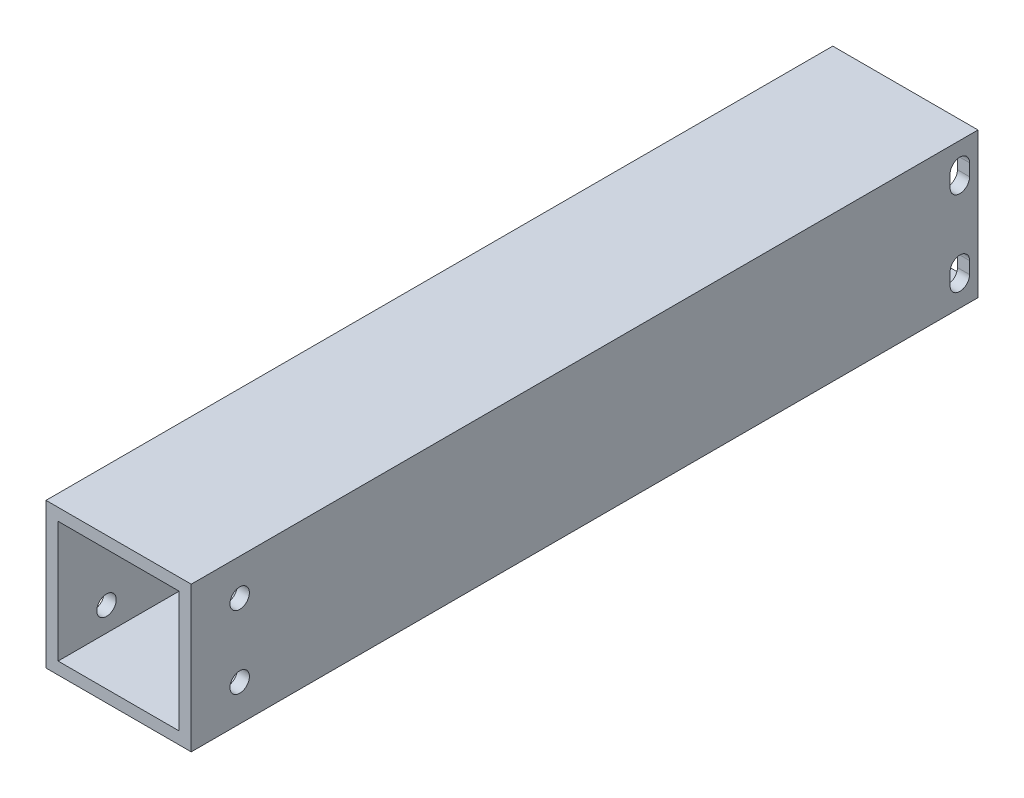
ISO-10303-21;
HEADER;
FILE_DESCRIPTION(('STEP AP214'),'2;1');
FILE_NAME('part.step','',(''),(''),'','','');
FILE_SCHEMA(('AUTOMOTIVE_DESIGN { 1 0 10303 214 1 1 1 1 }'));
ENDSEC;
DATA;
#1=APPLICATION_CONTEXT('core data for automotive mechanical design processes');
#2=APPLICATION_PROTOCOL_DEFINITION('international standard','automotive_design',2000,#1);
#3=PRODUCT_CONTEXT('',#1,'mechanical');
#4=PRODUCT('Part','Part','',(#3));
#5=PRODUCT_RELATED_PRODUCT_CATEGORY('part','',(#4));
#6=PRODUCT_DEFINITION_FORMATION('','',#4);
#7=PRODUCT_DEFINITION_CONTEXT('part definition',#1,'design');
#8=PRODUCT_DEFINITION('design','',#6,#7);
#9=PRODUCT_DEFINITION_SHAPE('','',#8);
#10=(LENGTH_UNIT() NAMED_UNIT(*) SI_UNIT(.MILLI.,.METRE.));
#11=(NAMED_UNIT(*) PLANE_ANGLE_UNIT() SI_UNIT($,.RADIAN.));
#12=(NAMED_UNIT(*) SI_UNIT($,.STERADIAN.) SOLID_ANGLE_UNIT());
#13=UNCERTAINTY_MEASURE_WITH_UNIT(LENGTH_MEASURE(1.E-05),#10,'distance_accuracy_value','');
#14=(GEOMETRIC_REPRESENTATION_CONTEXT(3) GLOBAL_UNCERTAINTY_ASSIGNED_CONTEXT((#13)) GLOBAL_UNIT_ASSIGNED_CONTEXT((#10,
#11,#12)) REPRESENTATION_CONTEXT('',''));
#15=CARTESIAN_POINT('',(0.,0.,0.));
#16=DIRECTION('',(0.,0.,1.));
#17=DIRECTION('',(1.,0.,0.));
#18=AXIS2_PLACEMENT_3D('',#15,#16,#17);
#19=CARTESIAN_POINT('',(0.,28.575,157.1625));
#20=DIRECTION('',(1.,0.,0.));
#21=DIRECTION('',(0.,0.,-1.));
#22=AXIS2_PLACEMENT_3D('',#19,#20,#21);
#23=CYLINDRICAL_SURFACE('',#22,2.55269999999999);
#24=CARTESIAN_POINT('',(0.,28.575,157.1625));
#25=DIRECTION('',(1.,0.,0.));
#26=DIRECTION('',(0.,0.,-1.));
#27=AXIS2_PLACEMENT_3D('',#24,#25,#26);
#28=CIRCLE('',#27,2.55269999999999);
#29=CARTESIAN_POINT('',(0.,28.575,159.7152));
#30=VERTEX_POINT('',#29);
#31=CARTESIAN_POINT('',(0.,28.575,154.6098));
#32=VERTEX_POINT('',#31);
#33=EDGE_CURVE('E273',#30,#32,#28,.T.);
#34=ORIENTED_EDGE('',*,*,#33,.F.);
#35=DIRECTION('',(1.,0.,0.));
#36=VECTOR('',#35,1.);
#37=CARTESIAN_POINT('',(0.,28.575,159.7152));
#38=LINE('',#37,#36);
#39=CARTESIAN_POINT('',(3.1749999999017,28.575,159.7152));
#40=VERTEX_POINT('',#39);
#41=EDGE_CURVE('E187',#30,#40,#38,.T.);
#42=ORIENTED_EDGE('',*,*,#41,.T.);
#43=CARTESIAN_POINT('',(3.1749999999017,28.575,157.1625));
#44=DIRECTION('',(1.,0.,0.));
#45=DIRECTION('',(0.,0.,-1.));
#46=AXIS2_PLACEMENT_3D('',#43,#44,#45);
#47=CIRCLE('',#46,2.55269999999999);
#48=CARTESIAN_POINT('',(3.1749999999017,28.575,154.6098));
#49=VERTEX_POINT('',#48);
#50=EDGE_CURVE('E195',#40,#49,#47,.T.);
#51=ORIENTED_EDGE('',*,*,#50,.T.);
#52=DIRECTION('',(-1.,0.,0.));
#53=VECTOR('',#52,1.);
#54=CARTESIAN_POINT('',(0.,28.575,154.6098));
#55=LINE('',#54,#53);
#56=EDGE_CURVE('E216',#49,#32,#55,.T.);
#57=ORIENTED_EDGE('',*,*,#56,.T.);
#58=EDGE_LOOP('',(#34,#42,#51,#57));
#59=FACE_BOUND('',#58,.T.);
#60=ADVANCED_FACE('F16',(#59),#23,.F.);
#61=CARTESIAN_POINT('',(0.,28.575,154.6098));
#62=DIRECTION('',(0.,0.,-1.));
#63=DIRECTION('',(-1.,0.,0.));
#64=AXIS2_PLACEMENT_3D('',#61,#62,#63);
#65=PLANE('',#64);
#66=DIRECTION('',(0.,1.,0.));
#67=VECTOR('',#66,1.);
#68=CARTESIAN_POINT('',(0.,38.1,154.6098));
#69=LINE('',#68,#67);
#70=CARTESIAN_POINT('',(0.,31.75,154.6098));
#71=VERTEX_POINT('',#70);
#72=EDGE_CURVE('E272',#32,#71,#69,.T.);
#73=ORIENTED_EDGE('',*,*,#72,.F.);
#74=ORIENTED_EDGE('',*,*,#56,.F.);
#75=DIRECTION('',(0.,-1.,0.));
#76=VECTOR('',#75,1.);
#77=CARTESIAN_POINT('',(3.1749999999017,34.925,154.6098));
#78=LINE('',#77,#76);
#79=CARTESIAN_POINT('',(3.1749999999017,31.75,154.6098));
#80=VERTEX_POINT('',#79);
#81=EDGE_CURVE('E306',#49,#80,#78,.F.);
#82=ORIENTED_EDGE('',*,*,#81,.T.);
#83=DIRECTION('',(1.,0.,0.));
#84=VECTOR('',#83,1.);
#85=CARTESIAN_POINT('',(0.,31.75,154.6098));
#86=LINE('',#85,#84);
#87=EDGE_CURVE('E174',#80,#71,#86,.F.);
#88=ORIENTED_EDGE('',*,*,#87,.T.);
#89=EDGE_LOOP('',(#73,#74,#82,#88));
#90=FACE_BOUND('',#89,.T.);
#91=ADVANCED_FACE('F692',(#90),#65,.F.);
#92=CARTESIAN_POINT('',(0.,31.75,157.1625));
#93=DIRECTION('',(1.,0.,0.));
#94=DIRECTION('',(0.,0.,-1.));
#95=AXIS2_PLACEMENT_3D('',#92,#93,#94);
#96=CYLINDRICAL_SURFACE('',#95,2.55269999999999);
#97=CARTESIAN_POINT('',(0.,31.75,157.1625));
#98=DIRECTION('',(1.,0.,0.));
#99=DIRECTION('',(0.,0.,-1.));
#100=AXIS2_PLACEMENT_3D('',#97,#98,#99);
#101=CIRCLE('',#100,2.55269999999999);
#102=CARTESIAN_POINT('',(0.,31.75,159.7152));
#103=VERTEX_POINT('',#102);
#104=EDGE_CURVE('E270',#71,#103,#101,.T.);
#105=ORIENTED_EDGE('',*,*,#104,.F.);
#106=ORIENTED_EDGE('',*,*,#87,.F.);
#107=CARTESIAN_POINT('',(3.1749999999017,31.75,157.1625));
#108=DIRECTION('',(1.,0.,0.));
#109=DIRECTION('',(0.,0.,-1.));
#110=AXIS2_PLACEMENT_3D('',#107,#108,#109);
#111=CIRCLE('',#110,2.55269999999999);
#112=CARTESIAN_POINT('',(3.1749999999017,31.75,159.7152));
#113=VERTEX_POINT('',#112);
#114=EDGE_CURVE('E19',#80,#113,#111,.T.);
#115=ORIENTED_EDGE('',*,*,#114,.T.);
#116=DIRECTION('',(1.,0.,0.));
#117=VECTOR('',#116,1.);
#118=CARTESIAN_POINT('',(0.,31.75,159.7152));
#119=LINE('',#118,#117);
#120=EDGE_CURVE('E181',#113,#103,#119,.F.);
#121=ORIENTED_EDGE('',*,*,#120,.T.);
#122=EDGE_LOOP('',(#105,#106,#115,#121));
#123=FACE_BOUND('',#122,.T.);
#124=ADVANCED_FACE('F197',(#123),#96,.F.);
#125=CARTESIAN_POINT('',(0.,28.575,159.7152));
#126=DIRECTION('',(0.,0.,1.));
#127=DIRECTION('',(1.,0.,0.));
#128=AXIS2_PLACEMENT_3D('',#125,#126,#127);
#129=PLANE('',#128);
#130=DIRECTION('',(0.,1.,0.));
#131=VECTOR('',#130,1.);
#132=CARTESIAN_POINT('',(0.,38.1,159.7152));
#133=LINE('',#132,#131);
#134=EDGE_CURVE('E186',#103,#30,#133,.F.);
#135=ORIENTED_EDGE('',*,*,#134,.F.);
#136=ORIENTED_EDGE('',*,*,#120,.F.);
#137=DIRECTION('',(0.,-1.,0.));
#138=VECTOR('',#137,1.);
#139=CARTESIAN_POINT('',(3.1749999999017,34.925,159.7152));
#140=LINE('',#139,#138);
#141=EDGE_CURVE('E184',#113,#40,#140,.T.);
#142=ORIENTED_EDGE('',*,*,#141,.T.);
#143=ORIENTED_EDGE('',*,*,#41,.F.);
#144=EDGE_LOOP('',(#135,#136,#142,#143));
#145=FACE_BOUND('',#144,.T.);
#146=ADVANCED_FACE('F183',(#145),#129,.F.);
#147=CARTESIAN_POINT('',(0.,9.525,346.075));
#148=DIRECTION('',(1.,0.,0.));
#149=DIRECTION('',(0.,0.,-1.));
#150=AXIS2_PLACEMENT_3D('',#147,#148,#149);
#151=CYLINDRICAL_SURFACE('',#150,2.55270000000002);
#152=CARTESIAN_POINT('',(3.1749999999017,9.525,346.075));
#153=DIRECTION('',(1.,0.,0.));
#154=DIRECTION('',(0.,0.,-1.));
#155=AXIS2_PLACEMENT_3D('',#152,#153,#154);
#156=CIRCLE('',#155,2.55270000000002);
#157=CARTESIAN_POINT('',(3.1749999999017,9.525,343.5223));
#158=VERTEX_POINT('',#157);
#159=EDGE_CURVE('E304',#158,#158,#156,.T.);
#160=ORIENTED_EDGE('',*,*,#159,.T.);
#161=EDGE_LOOP('',(#160));
#162=FACE_BOUND('',#161,.T.);
#163=CARTESIAN_POINT('',(0.,9.525,346.075));
#164=DIRECTION('',(1.,0.,0.));
#165=DIRECTION('',(0.,0.,-1.));
#166=AXIS2_PLACEMENT_3D('',#163,#164,#165);
#167=CIRCLE('',#166,2.55270000000002);
#168=CARTESIAN_POINT('',(0.,9.525,343.5223));
#169=VERTEX_POINT('',#168);
#170=EDGE_CURVE('E267',#169,#169,#167,.T.);
#171=ORIENTED_EDGE('',*,*,#170,.F.);
#172=EDGE_LOOP('',(#171));
#173=FACE_BOUND('',#172,.T.);
#174=ADVANCED_FACE('F668',(#162,#173),#151,.F.);
#175=CARTESIAN_POINT('',(0.,28.575,346.075));
#176=DIRECTION('',(1.,0.,0.));
#177=DIRECTION('',(0.,0.,-1.));
#178=AXIS2_PLACEMENT_3D('',#175,#176,#177);
#179=CYLINDRICAL_SURFACE('',#178,2.55270000000002);
#180=CARTESIAN_POINT('',(3.1749999999017,28.575,346.075));
#181=DIRECTION('',(1.,0.,0.));
#182=DIRECTION('',(0.,0.,-1.));
#183=AXIS2_PLACEMENT_3D('',#180,#181,#182);
#184=CIRCLE('',#183,2.55270000000002);
#185=CARTESIAN_POINT('',(3.1749999999017,28.575,343.5223));
#186=VERTEX_POINT('',#185);
#187=EDGE_CURVE('E301',#186,#186,#184,.T.);
#188=ORIENTED_EDGE('',*,*,#187,.T.);
#189=EDGE_LOOP('',(#188));
#190=FACE_BOUND('',#189,.T.);
#191=CARTESIAN_POINT('',(0.,28.575,346.075));
#192=DIRECTION('',(1.,0.,0.));
#193=DIRECTION('',(0.,0.,-1.));
#194=AXIS2_PLACEMENT_3D('',#191,#192,#193);
#195=CIRCLE('',#194,2.55270000000002);
#196=CARTESIAN_POINT('',(0.,28.575,343.5223));
#197=VERTEX_POINT('',#196);
#198=EDGE_CURVE('E264',#197,#197,#195,.T.);
#199=ORIENTED_EDGE('',*,*,#198,.F.);
#200=EDGE_LOOP('',(#199));
#201=FACE_BOUND('',#200,.T.);
#202=ADVANCED_FACE('F660',(#190,#201),#179,.F.);
#203=CARTESIAN_POINT('',(0.,9.525,157.1625));
#204=DIRECTION('',(1.,0.,0.));
#205=DIRECTION('',(0.,0.,-1.));
#206=AXIS2_PLACEMENT_3D('',#203,#204,#205);
#207=CYLINDRICAL_SURFACE('',#206,2.55269999999999);
#208=CARTESIAN_POINT('',(0.,9.525,157.1625));
#209=DIRECTION('',(1.,0.,0.));
#210=DIRECTION('',(0.,0.,-1.));
#211=AXIS2_PLACEMENT_3D('',#208,#209,#210);
#212=CIRCLE('',#211,2.55269999999999);
#213=CARTESIAN_POINT('',(0.,9.525,154.6098));
#214=VERTEX_POINT('',#213);
#215=CARTESIAN_POINT('',(0.,9.525,159.7152));
#216=VERTEX_POINT('',#215);
#217=EDGE_CURVE('E262',#214,#216,#212,.T.);
#218=ORIENTED_EDGE('',*,*,#217,.F.);
#219=DIRECTION('',(-1.,0.,0.));
#220=VECTOR('',#219,1.);
#221=CARTESIAN_POINT('',(0.,9.525,154.6098));
#222=LINE('',#221,#220);
#223=CARTESIAN_POINT('',(3.1749999999017,9.525,154.6098));
#224=VERTEX_POINT('',#223);
#225=EDGE_CURVE('E198',#214,#224,#222,.F.);
#226=ORIENTED_EDGE('',*,*,#225,.T.);
#227=CARTESIAN_POINT('',(3.1749999999017,9.525,157.1625));
#228=DIRECTION('',(1.,0.,0.));
#229=DIRECTION('',(0.,0.,-1.));
#230=AXIS2_PLACEMENT_3D('',#227,#228,#229);
#231=CIRCLE('',#230,2.55269999999999);
#232=CARTESIAN_POINT('',(3.1749999999017,9.525,159.7152));
#233=VERTEX_POINT('',#232);
#234=EDGE_CURVE('E294',#224,#233,#231,.T.);
#235=ORIENTED_EDGE('',*,*,#234,.T.);
#236=DIRECTION('',(1.,0.,0.));
#237=VECTOR('',#236,1.);
#238=CARTESIAN_POINT('',(0.,9.525,159.7152));
#239=LINE('',#238,#237);
#240=EDGE_CURVE('E211',#233,#216,#239,.F.);
#241=ORIENTED_EDGE('',*,*,#240,.T.);
#242=EDGE_LOOP('',(#218,#226,#235,#241));
#243=FACE_BOUND('',#242,.T.);
#244=ADVANCED_FACE('F651',(#243),#207,.F.);
#245=CARTESIAN_POINT('',(0.,9.525,159.7152));
#246=DIRECTION('',(0.,0.,1.));
#247=DIRECTION('',(1.,0.,0.));
#248=AXIS2_PLACEMENT_3D('',#245,#246,#247);
#249=PLANE('',#248);
#250=DIRECTION('',(0.,1.,0.));
#251=VECTOR('',#250,1.);
#252=CARTESIAN_POINT('',(0.,38.1,159.7152));
#253=LINE('',#252,#251);
#254=CARTESIAN_POINT('',(0.,6.34999999999999,159.7152));
#255=VERTEX_POINT('',#254);
#256=EDGE_CURVE('E261',#216,#255,#253,.F.);
#257=ORIENTED_EDGE('',*,*,#256,.F.);
#258=ORIENTED_EDGE('',*,*,#240,.F.);
#259=DIRECTION('',(0.,-1.,0.));
#260=VECTOR('',#259,1.);
#261=CARTESIAN_POINT('',(3.1749999999017,34.925,159.7152));
#262=LINE('',#261,#260);
#263=CARTESIAN_POINT('',(3.1749999999017,6.34999999999999,159.7152));
#264=VERTEX_POINT('',#263);
#265=EDGE_CURVE('E296',#233,#264,#262,.T.);
#266=ORIENTED_EDGE('',*,*,#265,.T.);
#267=DIRECTION('',(1.,0.,0.));
#268=VECTOR('',#267,1.);
#269=CARTESIAN_POINT('',(0.,6.34999999999999,159.7152));
#270=LINE('',#269,#268);
#271=EDGE_CURVE('E206',#264,#255,#270,.F.);
#272=ORIENTED_EDGE('',*,*,#271,.T.);
#273=EDGE_LOOP('',(#257,#258,#266,#272));
#274=FACE_BOUND('',#273,.T.);
#275=ADVANCED_FACE('F642',(#274),#249,.F.);
#276=CARTESIAN_POINT('',(0.,6.34999999999999,157.1625));
#277=DIRECTION('',(1.,0.,0.));
#278=DIRECTION('',(0.,0.,-1.));
#279=AXIS2_PLACEMENT_3D('',#276,#277,#278);
#280=CYLINDRICAL_SURFACE('',#279,2.55269999999999);
#281=CARTESIAN_POINT('',(0.,6.34999999999999,157.1625));
#282=DIRECTION('',(1.,0.,0.));
#283=DIRECTION('',(0.,0.,-1.));
#284=AXIS2_PLACEMENT_3D('',#281,#282,#283);
#285=CIRCLE('',#284,2.55269999999999);
#286=CARTESIAN_POINT('',(0.,6.34999999999999,154.6098));
#287=VERTEX_POINT('',#286);
#288=EDGE_CURVE('E258',#255,#287,#285,.T.);
#289=ORIENTED_EDGE('',*,*,#288,.F.);
#290=ORIENTED_EDGE('',*,*,#271,.F.);
#291=CARTESIAN_POINT('',(3.1749999999017,6.34999999999999,157.1625));
#292=DIRECTION('',(1.,0.,0.));
#293=DIRECTION('',(0.,0.,-1.));
#294=AXIS2_PLACEMENT_3D('',#291,#292,#293);
#295=CIRCLE('',#294,2.55269999999999);
#296=CARTESIAN_POINT('',(3.1749999999017,6.34999999999999,154.6098));
#297=VERTEX_POINT('',#296);
#298=EDGE_CURVE('E298',#264,#297,#295,.T.);
#299=ORIENTED_EDGE('',*,*,#298,.T.);
#300=DIRECTION('',(-1.,0.,0.));
#301=VECTOR('',#300,1.);
#302=CARTESIAN_POINT('',(0.,6.34999999999999,154.6098));
#303=LINE('',#302,#301);
#304=EDGE_CURVE('E199',#297,#287,#303,.T.);
#305=ORIENTED_EDGE('',*,*,#304,.T.);
#306=EDGE_LOOP('',(#289,#290,#299,#305));
#307=FACE_BOUND('',#306,.T.);
#308=ADVANCED_FACE('F633',(#307),#280,.F.);
#309=CARTESIAN_POINT('',(0.,9.525,154.6098));
#310=DIRECTION('',(0.,0.,-1.));
#311=DIRECTION('',(-1.,0.,0.));
#312=AXIS2_PLACEMENT_3D('',#309,#310,#311);
#313=PLANE('',#312);
#314=DIRECTION('',(0.,1.,0.));
#315=VECTOR('',#314,1.);
#316=CARTESIAN_POINT('',(0.,38.1,154.6098));
#317=LINE('',#316,#315);
#318=EDGE_CURVE('E260',#287,#214,#317,.T.);
#319=ORIENTED_EDGE('',*,*,#318,.F.);
#320=ORIENTED_EDGE('',*,*,#304,.F.);
#321=DIRECTION('',(0.,-1.,0.));
#322=VECTOR('',#321,1.);
#323=CARTESIAN_POINT('',(3.1749999999017,34.925,154.6098));
#324=LINE('',#323,#322);
#325=EDGE_CURVE('E297',#297,#224,#324,.F.);
#326=ORIENTED_EDGE('',*,*,#325,.T.);
#327=ORIENTED_EDGE('',*,*,#225,.F.);
#328=EDGE_LOOP('',(#319,#320,#326,#327));
#329=FACE_BOUND('',#328,.T.);
#330=ADVANCED_FACE('F624',(#329),#313,.F.);
#331=CARTESIAN_POINT('',(3.1749999999017,34.925,152.4));
#332=DIRECTION('',(-1.,0.,0.));
#333=DIRECTION('',(0.,-1.,0.));
#334=AXIS2_PLACEMENT_3D('',#331,#332,#333);
#335=PLANE('',#334);
#336=DIRECTION('',(0.,0.,-1.));
#337=VECTOR('',#336,1.);
#338=CARTESIAN_POINT('',(3.1749999999017,3.17499999992628,152.4));
#339=LINE('',#338,#337);
#340=CARTESIAN_POINT('',(3.1749999999017,3.17499999992628,358.775));
#341=VERTEX_POINT('',#340);
#342=CARTESIAN_POINT('',(3.1749999999017,3.17499999992628,152.4));
#343=VERTEX_POINT('',#342);
#344=EDGE_CURVE('E315',#341,#343,#339,.T.);
#345=ORIENTED_EDGE('',*,*,#344,.T.);
#346=DIRECTION('',(0.,1.,0.));
#347=VECTOR('',#346,1.);
#348=CARTESIAN_POINT('',(3.1749999999017,38.1,152.4));
#349=LINE('',#348,#347);
#350=CARTESIAN_POINT('',(3.1749999999017,34.925,152.4));
#351=VERTEX_POINT('',#350);
#352=EDGE_CURVE('E364',#351,#343,#349,.F.);
#353=ORIENTED_EDGE('',*,*,#352,.F.);
#354=DIRECTION('',(0.,0.,1.));
#355=VECTOR('',#354,1.);
#356=CARTESIAN_POINT('',(3.1749999999017,34.925,152.4));
#357=LINE('',#356,#355);
#358=CARTESIAN_POINT('',(3.1749999999017,34.925,358.775));
#359=VERTEX_POINT('',#358);
#360=EDGE_CURVE('E293',#351,#359,#357,.T.);
#361=ORIENTED_EDGE('',*,*,#360,.T.);
#362=DIRECTION('',(0.,1.,0.));
#363=VECTOR('',#362,1.);
#364=CARTESIAN_POINT('',(3.1749999999017,38.1,358.775));
#365=LINE('',#364,#363);
#366=EDGE_CURVE('E341',#341,#359,#365,.T.);
#367=ORIENTED_EDGE('',*,*,#366,.F.);
#368=EDGE_LOOP('',(#345,#353,#361,#367));
#369=FACE_BOUND('',#368,.T.);
#370=ORIENTED_EDGE('',*,*,#234,.F.);
#371=ORIENTED_EDGE('',*,*,#325,.F.);
#372=ORIENTED_EDGE('',*,*,#298,.F.);
#373=ORIENTED_EDGE('',*,*,#265,.F.);
#374=EDGE_LOOP('',(#370,#371,#372,#373));
#375=FACE_BOUND('',#374,.T.);
#376=ORIENTED_EDGE('',*,*,#187,.F.);
#377=EDGE_LOOP('',(#376));
#378=FACE_BOUND('',#377,.T.);
#379=ORIENTED_EDGE('',*,*,#159,.F.);
#380=EDGE_LOOP('',(#379));
#381=FACE_BOUND('',#380,.T.);
#382=ORIENTED_EDGE('',*,*,#50,.F.);
#383=ORIENTED_EDGE('',*,*,#141,.F.);
#384=ORIENTED_EDGE('',*,*,#114,.F.);
#385=ORIENTED_EDGE('',*,*,#81,.F.);
#386=EDGE_LOOP('',(#382,#383,#384,#385));
#387=FACE_BOUND('',#386,.T.);
#388=ADVANCED_FACE('F191',(#369,#375,#378,#381,#387),#335,.F.);
#389=CARTESIAN_POINT('',(3.1749999999017,3.17499999992628,152.4));
#390=DIRECTION('',(0.,-1.,0.));
#391=DIRECTION('',(0.,0.,-1.));
#392=AXIS2_PLACEMENT_3D('',#389,#390,#391);
#393=PLANE('',#392);
#394=DIRECTION('',(0.,0.,1.));
#395=VECTOR('',#394,1.);
#396=CARTESIAN_POINT('',(34.925,3.17499999992628,152.4));
#397=LINE('',#396,#395);
#398=CARTESIAN_POINT('',(34.925,3.17499999992628,358.775));
#399=VERTEX_POINT('',#398);
#400=CARTESIAN_POINT('',(34.925,3.17499999992628,152.4));
#401=VERTEX_POINT('',#400);
#402=EDGE_CURVE('E318',#399,#401,#397,.F.);
#403=ORIENTED_EDGE('',*,*,#402,.T.);
#404=DIRECTION('',(-1.,0.,0.));
#405=VECTOR('',#404,1.);
#406=CARTESIAN_POINT('',(0.,3.17499999992628,152.4));
#407=LINE('',#406,#405);
#408=EDGE_CURVE('E366',#343,#401,#407,.F.);
#409=ORIENTED_EDGE('',*,*,#408,.F.);
#410=ORIENTED_EDGE('',*,*,#344,.F.);
#411=DIRECTION('',(1.,0.,0.));
#412=VECTOR('',#411,1.);
#413=CARTESIAN_POINT('',(38.1,3.17499999992628,358.775));
#414=LINE('',#413,#412);
#415=EDGE_CURVE('E351',#399,#341,#414,.F.);
#416=ORIENTED_EDGE('',*,*,#415,.F.);
#417=EDGE_LOOP('',(#403,#409,#410,#416));
#418=FACE_BOUND('',#417,.T.);
#419=ADVANCED_FACE('F443',(#418),#393,.F.);
#420=CARTESIAN_POINT('',(34.925,3.17499999992628,152.4));
#421=DIRECTION('',(1.,0.,0.));
#422=DIRECTION('',(0.,1.,0.));
#423=AXIS2_PLACEMENT_3D('',#420,#421,#422);
#424=PLANE('',#423);
#425=DIRECTION('',(0.,0.,1.));
#426=VECTOR('',#425,1.);
#427=CARTESIAN_POINT('',(34.925,34.925,152.4));
#428=LINE('',#427,#426);
#429=CARTESIAN_POINT('',(34.925,34.925,358.775));
#430=VERTEX_POINT('',#429);
#431=CARTESIAN_POINT('',(34.925,34.925,152.4));
#432=VERTEX_POINT('',#431);
#433=EDGE_CURVE('E321',#430,#432,#428,.F.);
#434=ORIENTED_EDGE('',*,*,#433,.T.);
#435=DIRECTION('',(0.,1.,0.));
#436=VECTOR('',#435,1.);
#437=CARTESIAN_POINT('',(34.925,38.1,152.4));
#438=LINE('',#437,#436);
#439=EDGE_CURVE('E368',#401,#432,#438,.T.);
#440=ORIENTED_EDGE('',*,*,#439,.F.);
#441=ORIENTED_EDGE('',*,*,#402,.F.);
#442=DIRECTION('',(0.,1.,0.));
#443=VECTOR('',#442,1.);
#444=CARTESIAN_POINT('',(34.925,38.1,358.775));
#445=LINE('',#444,#443);
#446=EDGE_CURVE('E348',#430,#399,#445,.F.);
#447=ORIENTED_EDGE('',*,*,#446,.F.);
#448=EDGE_LOOP('',(#434,#440,#441,#447));
#449=FACE_BOUND('',#448,.T.);
#450=CARTESIAN_POINT('',(34.925,9.525,157.1625));
#451=DIRECTION('',(1.,0.,0.));
#452=DIRECTION('',(0.,0.,-1.));
#453=AXIS2_PLACEMENT_3D('',#450,#451,#452);
#454=CIRCLE('',#453,2.55269999999999);
#455=CARTESIAN_POINT('',(34.925,9.525,154.6098));
#456=VERTEX_POINT('',#455);
#457=CARTESIAN_POINT('',(34.925,9.525,159.7152));
#458=VERTEX_POINT('',#457);
#459=EDGE_CURVE('E228',#456,#458,#454,.T.);
#460=ORIENTED_EDGE('',*,*,#459,.T.);
#461=DIRECTION('',(0.,1.,0.));
#462=VECTOR('',#461,1.);
#463=CARTESIAN_POINT('',(34.925,9.525,159.7152));
#464=LINE('',#463,#462);
#465=CARTESIAN_POINT('',(34.925,6.34999999999999,159.7152));
#466=VERTEX_POINT('',#465);
#467=EDGE_CURVE('E219',#458,#466,#464,.F.);
#468=ORIENTED_EDGE('',*,*,#467,.T.);
#469=CARTESIAN_POINT('',(34.925,6.34999999999999,157.1625));
#470=DIRECTION('',(1.,0.,0.));
#471=DIRECTION('',(0.,0.,-1.));
#472=AXIS2_PLACEMENT_3D('',#469,#470,#471);
#473=CIRCLE('',#472,2.55269999999999);
#474=CARTESIAN_POINT('',(34.925,6.34999999999999,154.6098));
#475=VERTEX_POINT('',#474);
#476=EDGE_CURVE('E276',#466,#475,#473,.T.);
#477=ORIENTED_EDGE('',*,*,#476,.T.);
#478=DIRECTION('',(0.,1.,0.));
#479=VECTOR('',#478,1.);
#480=CARTESIAN_POINT('',(34.925,9.525,154.6098));
#481=LINE('',#480,#479);
#482=EDGE_CURVE('E224',#475,#456,#481,.T.);
#483=ORIENTED_EDGE('',*,*,#482,.T.);
#484=EDGE_LOOP('',(#460,#468,#477,#483));
#485=FACE_BOUND('',#484,.T.);
#486=CARTESIAN_POINT('',(34.925,28.575,346.075));
#487=DIRECTION('',(1.,0.,0.));
#488=DIRECTION('',(0.,0.,-1.));
#489=AXIS2_PLACEMENT_3D('',#486,#487,#488);
#490=CIRCLE('',#489,2.55270000000002);
#491=CARTESIAN_POINT('',(34.925,28.575,343.5223));
#492=VERTEX_POINT('',#491);
#493=EDGE_CURVE('E281',#492,#492,#490,.T.);
#494=ORIENTED_EDGE('',*,*,#493,.T.);
#495=EDGE_LOOP('',(#494));
#496=FACE_BOUND('',#495,.T.);
#497=CARTESIAN_POINT('',(34.925,9.525,346.075));
#498=DIRECTION('',(1.,0.,0.));
#499=DIRECTION('',(0.,0.,-1.));
#500=AXIS2_PLACEMENT_3D('',#497,#498,#499);
#501=CIRCLE('',#500,2.55270000000002);
#502=CARTESIAN_POINT('',(34.925,9.525,343.5223));
#503=VERTEX_POINT('',#502);
#504=EDGE_CURVE('E284',#503,#503,#501,.T.);
#505=ORIENTED_EDGE('',*,*,#504,.T.);
#506=EDGE_LOOP('',(#505));
#507=FACE_BOUND('',#506,.T.);
#508=CARTESIAN_POINT('',(34.925,28.575,157.1625));
#509=DIRECTION('',(1.,0.,0.));
#510=DIRECTION('',(0.,0.,-1.));
#511=AXIS2_PLACEMENT_3D('',#508,#509,#510);
#512=CIRCLE('',#511,2.55269999999999);
#513=CARTESIAN_POINT('',(34.925,28.575,159.7152));
#514=VERTEX_POINT('',#513);
#515=CARTESIAN_POINT('',(34.925,28.575,154.6098));
#516=VERTEX_POINT('',#515);
#517=EDGE_CURVE('E238',#514,#516,#512,.T.);
#518=ORIENTED_EDGE('',*,*,#517,.T.);
#519=DIRECTION('',(0.,1.,0.));
#520=VECTOR('',#519,1.);
#521=CARTESIAN_POINT('',(34.925,28.575,154.6098));
#522=LINE('',#521,#520);
#523=CARTESIAN_POINT('',(34.925,31.75,154.6098));
#524=VERTEX_POINT('',#523);
#525=EDGE_CURVE('E229',#516,#524,#522,.T.);
#526=ORIENTED_EDGE('',*,*,#525,.T.);
#527=CARTESIAN_POINT('',(34.925,31.75,157.1625));
#528=DIRECTION('',(1.,0.,0.));
#529=DIRECTION('',(0.,0.,-1.));
#530=AXIS2_PLACEMENT_3D('',#527,#528,#529);
#531=CIRCLE('',#530,2.55269999999999);
#532=CARTESIAN_POINT('',(34.925,31.75,159.7152));
#533=VERTEX_POINT('',#532);
#534=EDGE_CURVE('E288',#524,#533,#531,.T.);
#535=ORIENTED_EDGE('',*,*,#534,.T.);
#536=DIRECTION('',(0.,1.,0.));
#537=VECTOR('',#536,1.);
#538=CARTESIAN_POINT('',(34.925,28.575,159.7152));
#539=LINE('',#538,#537);
#540=EDGE_CURVE('E234',#533,#514,#539,.F.);
#541=ORIENTED_EDGE('',*,*,#540,.T.);
#542=EDGE_LOOP('',(#518,#526,#535,#541));
#543=FACE_BOUND('',#542,.T.);
#544=ADVANCED_FACE('F440',(#449,#485,#496,#507,#543),#424,.F.);
#545=CARTESIAN_POINT('',(34.925,34.925,152.4));
#546=DIRECTION('',(0.,1.,0.));
#547=DIRECTION('',(0.,0.,1.));
#548=AXIS2_PLACEMENT_3D('',#545,#546,#547);
#549=PLANE('',#548);
#550=ORIENTED_EDGE('',*,*,#360,.F.);
#551=DIRECTION('',(-1.,0.,0.));
#552=VECTOR('',#551,1.);
#553=CARTESIAN_POINT('',(0.,34.925,152.4));
#554=LINE('',#553,#552);
#555=EDGE_CURVE('E370',#432,#351,#554,.T.);
#556=ORIENTED_EDGE('',*,*,#555,.F.);
#557=ORIENTED_EDGE('',*,*,#433,.F.);
#558=DIRECTION('',(1.,0.,0.));
#559=VECTOR('',#558,1.);
#560=CARTESIAN_POINT('',(38.1,34.925,358.775));
#561=LINE('',#560,#559);
#562=EDGE_CURVE('E345',#359,#430,#561,.T.);
#563=ORIENTED_EDGE('',*,*,#562,.F.);
#564=EDGE_LOOP('',(#550,#556,#557,#563));
#565=FACE_BOUND('',#564,.T.);
#566=ADVANCED_FACE('F442',(#565),#549,.F.);
#567=CARTESIAN_POINT('',(0.,28.575,157.1625));
#568=DIRECTION('',(1.,0.,0.));
#569=DIRECTION('',(0.,0.,-1.));
#570=AXIS2_PLACEMENT_3D('',#567,#568,#569);
#571=CYLINDRICAL_SURFACE('',#570,2.55269999999999);
#572=CARTESIAN_POINT('',(38.1,28.575,157.1625));
#573=DIRECTION('',(1.,0.,0.));
#574=DIRECTION('',(0.,0.,-1.));
#575=AXIS2_PLACEMENT_3D('',#572,#573,#574);
#576=CIRCLE('',#575,2.55269999999999);
#577=CARTESIAN_POINT('',(38.1,28.575,154.6098));
#578=VERTEX_POINT('',#577);
#579=CARTESIAN_POINT('',(38.1,28.575,159.7152));
#580=VERTEX_POINT('',#579);
#581=EDGE_CURVE('E255',#578,#580,#576,.F.);
#582=ORIENTED_EDGE('',*,*,#581,.F.);
#583=DIRECTION('',(-1.,0.,0.));
#584=VECTOR('',#583,1.);
#585=CARTESIAN_POINT('',(0.,28.575,154.6098));
#586=LINE('',#585,#584);
#587=EDGE_CURVE('E287',#578,#516,#586,.T.);
#588=ORIENTED_EDGE('',*,*,#587,.T.);
#589=ORIENTED_EDGE('',*,*,#517,.F.);
#590=DIRECTION('',(1.,0.,0.));
#591=VECTOR('',#590,1.);
#592=CARTESIAN_POINT('',(0.,28.575,159.7152));
#593=LINE('',#592,#591);
#594=EDGE_CURVE('E237',#514,#580,#593,.T.);
#595=ORIENTED_EDGE('',*,*,#594,.T.);
#596=EDGE_LOOP('',(#582,#588,#589,#595));
#597=FACE_BOUND('',#596,.T.);
#598=ADVANCED_FACE('F435',(#597),#571,.F.);
#599=CARTESIAN_POINT('',(0.,28.575,159.7152));
#600=DIRECTION('',(0.,0.,1.));
#601=DIRECTION('',(1.,0.,0.));
#602=AXIS2_PLACEMENT_3D('',#599,#600,#601);
#603=PLANE('',#602);
#604=DIRECTION('',(0.,1.,0.));
#605=VECTOR('',#604,1.);
#606=CARTESIAN_POINT('',(38.1,38.1,159.7152));
#607=LINE('',#606,#605);
#608=CARTESIAN_POINT('',(38.1,31.75,159.7152));
#609=VERTEX_POINT('',#608);
#610=EDGE_CURVE('E254',#580,#609,#607,.T.);
#611=ORIENTED_EDGE('',*,*,#610,.F.);
#612=ORIENTED_EDGE('',*,*,#594,.F.);
#613=ORIENTED_EDGE('',*,*,#540,.F.);
#614=DIRECTION('',(1.,0.,0.));
#615=VECTOR('',#614,1.);
#616=CARTESIAN_POINT('',(0.,31.75,159.7152));
#617=LINE('',#616,#615);
#618=EDGE_CURVE('E233',#533,#609,#617,.T.);
#619=ORIENTED_EDGE('',*,*,#618,.T.);
#620=EDGE_LOOP('',(#611,#612,#613,#619));
#621=FACE_BOUND('',#620,.T.);
#622=ADVANCED_FACE('F438',(#621),#603,.F.);
#623=CARTESIAN_POINT('',(0.,31.75,157.1625));
#624=DIRECTION('',(1.,0.,0.));
#625=DIRECTION('',(0.,0.,-1.));
#626=AXIS2_PLACEMENT_3D('',#623,#624,#625);
#627=CYLINDRICAL_SURFACE('',#626,2.55269999999999);
#628=CARTESIAN_POINT('',(38.1,31.75,157.1625));
#629=DIRECTION('',(1.,0.,0.));
#630=DIRECTION('',(0.,0.,-1.));
#631=AXIS2_PLACEMENT_3D('',#628,#629,#630);
#632=CIRCLE('',#631,2.55269999999999);
#633=CARTESIAN_POINT('',(38.1,31.75,154.6098));
#634=VERTEX_POINT('',#633);
#635=EDGE_CURVE('E252',#609,#634,#632,.F.);
#636=ORIENTED_EDGE('',*,*,#635,.F.);
#637=ORIENTED_EDGE('',*,*,#618,.F.);
#638=ORIENTED_EDGE('',*,*,#534,.F.);
#639=DIRECTION('',(-1.,0.,0.));
#640=VECTOR('',#639,1.);
#641=CARTESIAN_POINT('',(0.,31.75,154.6098));
#642=LINE('',#641,#640);
#643=EDGE_CURVE('E232',#524,#634,#642,.F.);
#644=ORIENTED_EDGE('',*,*,#643,.T.);
#645=EDGE_LOOP('',(#636,#637,#638,#644));
#646=FACE_BOUND('',#645,.T.);
#647=ADVANCED_FACE('F431',(#646),#627,.F.);
#648=CARTESIAN_POINT('',(0.,28.575,154.6098));
#649=DIRECTION('',(0.,0.,-1.));
#650=DIRECTION('',(-1.,0.,0.));
#651=AXIS2_PLACEMENT_3D('',#648,#649,#650);
#652=PLANE('',#651);
#653=DIRECTION('',(0.,1.,0.));
#654=VECTOR('',#653,1.);
#655=CARTESIAN_POINT('',(38.1,38.1,154.6098));
#656=LINE('',#655,#654);
#657=EDGE_CURVE('E251',#634,#578,#656,.F.);
#658=ORIENTED_EDGE('',*,*,#657,.F.);
#659=ORIENTED_EDGE('',*,*,#643,.F.);
#660=ORIENTED_EDGE('',*,*,#525,.F.);
#661=ORIENTED_EDGE('',*,*,#587,.F.);
#662=EDGE_LOOP('',(#658,#659,#660,#661));
#663=FACE_BOUND('',#662,.T.);
#664=ADVANCED_FACE('F433',(#663),#652,.F.);
#665=CARTESIAN_POINT('',(0.,9.525,346.075));
#666=DIRECTION('',(1.,0.,0.));
#667=DIRECTION('',(0.,0.,-1.));
#668=AXIS2_PLACEMENT_3D('',#665,#666,#667);
#669=CYLINDRICAL_SURFACE('',#668,2.55270000000002);
#670=CARTESIAN_POINT('',(38.1,9.525,346.075));
#671=DIRECTION('',(1.,0.,0.));
#672=DIRECTION('',(0.,0.,-1.));
#673=AXIS2_PLACEMENT_3D('',#670,#671,#672);
#674=CIRCLE('',#673,2.55270000000002);
#675=CARTESIAN_POINT('',(38.1,9.525,343.5223));
#676=VERTEX_POINT('',#675);
#677=EDGE_CURVE('E248',#676,#676,#674,.F.);
#678=ORIENTED_EDGE('',*,*,#677,.F.);
#679=EDGE_LOOP('',(#678));
#680=FACE_BOUND('',#679,.T.);
#681=ORIENTED_EDGE('',*,*,#504,.F.);
#682=EDGE_LOOP('',(#681));
#683=FACE_BOUND('',#682,.T.);
#684=ADVANCED_FACE('F490',(#680,#683),#669,.F.);
#685=CARTESIAN_POINT('',(0.,28.575,346.075));
#686=DIRECTION('',(1.,0.,0.));
#687=DIRECTION('',(0.,0.,-1.));
#688=AXIS2_PLACEMENT_3D('',#685,#686,#687);
#689=CYLINDRICAL_SURFACE('',#688,2.55270000000002);
#690=CARTESIAN_POINT('',(38.1,28.575,346.075));
#691=DIRECTION('',(1.,0.,0.));
#692=DIRECTION('',(0.,0.,-1.));
#693=AXIS2_PLACEMENT_3D('',#690,#691,#692);
#694=CIRCLE('',#693,2.55270000000002);
#695=CARTESIAN_POINT('',(38.1,28.575,343.5223));
#696=VERTEX_POINT('',#695);
#697=EDGE_CURVE('E245',#696,#696,#694,.F.);
#698=ORIENTED_EDGE('',*,*,#697,.F.);
#699=EDGE_LOOP('',(#698));
#700=FACE_BOUND('',#699,.T.);
#701=ORIENTED_EDGE('',*,*,#493,.F.);
#702=EDGE_LOOP('',(#701));
#703=FACE_BOUND('',#702,.T.);
#704=ADVANCED_FACE('F486',(#700,#703),#689,.F.);
#705=CARTESIAN_POINT('',(0.,9.525,157.1625));
#706=DIRECTION('',(1.,0.,0.));
#707=DIRECTION('',(0.,0.,-1.));
#708=AXIS2_PLACEMENT_3D('',#705,#706,#707);
#709=CYLINDRICAL_SURFACE('',#708,2.55269999999999);
#710=CARTESIAN_POINT('',(38.1,9.525,157.1625));
#711=DIRECTION('',(1.,0.,0.));
#712=DIRECTION('',(0.,0.,-1.));
#713=AXIS2_PLACEMENT_3D('',#710,#711,#712);
#714=CIRCLE('',#713,2.55269999999999);
#715=CARTESIAN_POINT('',(38.1,9.525,159.7152));
#716=VERTEX_POINT('',#715);
#717=CARTESIAN_POINT('',(38.1,9.525,154.6098));
#718=VERTEX_POINT('',#717);
#719=EDGE_CURVE('E243',#716,#718,#714,.F.);
#720=ORIENTED_EDGE('',*,*,#719,.F.);
#721=DIRECTION('',(1.,0.,0.));
#722=VECTOR('',#721,1.);
#723=CARTESIAN_POINT('',(0.,9.525,159.7152));
#724=LINE('',#723,#722);
#725=EDGE_CURVE('E338',#716,#458,#724,.F.);
#726=ORIENTED_EDGE('',*,*,#725,.T.);
#727=ORIENTED_EDGE('',*,*,#459,.F.);
#728=DIRECTION('',(-1.,0.,0.));
#729=VECTOR('',#728,1.);
#730=CARTESIAN_POINT('',(0.,9.525,154.6098));
#731=LINE('',#730,#729);
#732=EDGE_CURVE('E227',#456,#718,#731,.F.);
#733=ORIENTED_EDGE('',*,*,#732,.T.);
#734=EDGE_LOOP('',(#720,#726,#727,#733));
#735=FACE_BOUND('',#734,.T.);
#736=ADVANCED_FACE('F482',(#735),#709,.F.);
#737=CARTESIAN_POINT('',(0.,9.525,154.6098));
#738=DIRECTION('',(0.,0.,-1.));
#739=DIRECTION('',(-1.,0.,0.));
#740=AXIS2_PLACEMENT_3D('',#737,#738,#739);
#741=PLANE('',#740);
#742=DIRECTION('',(0.,1.,0.));
#743=VECTOR('',#742,1.);
#744=CARTESIAN_POINT('',(38.1,38.1,154.6098));
#745=LINE('',#744,#743);
#746=CARTESIAN_POINT('',(38.1,6.34999999999999,154.6098));
#747=VERTEX_POINT('',#746);
#748=EDGE_CURVE('E242',#718,#747,#745,.F.);
#749=ORIENTED_EDGE('',*,*,#748,.F.);
#750=ORIENTED_EDGE('',*,*,#732,.F.);
#751=ORIENTED_EDGE('',*,*,#482,.F.);
#752=DIRECTION('',(1.,0.,0.));
#753=VECTOR('',#752,1.);
#754=CARTESIAN_POINT('',(0.,6.34999999999999,154.6098));
#755=LINE('',#754,#753);
#756=EDGE_CURVE('E223',#475,#747,#755,.T.);
#757=ORIENTED_EDGE('',*,*,#756,.T.);
#758=EDGE_LOOP('',(#749,#750,#751,#757));
#759=FACE_BOUND('',#758,.T.);
#760=ADVANCED_FACE('F478',(#759),#741,.F.);
#761=CARTESIAN_POINT('',(0.,6.34999999999999,157.1625));
#762=DIRECTION('',(1.,0.,0.));
#763=DIRECTION('',(0.,0.,-1.));
#764=AXIS2_PLACEMENT_3D('',#761,#762,#763);
#765=CYLINDRICAL_SURFACE('',#764,2.55269999999999);
#766=CARTESIAN_POINT('',(38.1,6.34999999999999,157.1625));
#767=DIRECTION('',(1.,0.,0.));
#768=DIRECTION('',(0.,0.,-1.));
#769=AXIS2_PLACEMENT_3D('',#766,#767,#768);
#770=CIRCLE('',#769,2.55269999999999);
#771=CARTESIAN_POINT('',(38.1,6.34999999999999,159.7152));
#772=VERTEX_POINT('',#771);
#773=EDGE_CURVE('E239',#747,#772,#770,.F.);
#774=ORIENTED_EDGE('',*,*,#773,.F.);
#775=ORIENTED_EDGE('',*,*,#756,.F.);
#776=ORIENTED_EDGE('',*,*,#476,.F.);
#777=DIRECTION('',(1.,0.,0.));
#778=VECTOR('',#777,1.);
#779=CARTESIAN_POINT('',(0.,6.34999999999999,159.7152));
#780=LINE('',#779,#778);
#781=EDGE_CURVE('E222',#466,#772,#780,.T.);
#782=ORIENTED_EDGE('',*,*,#781,.T.);
#783=EDGE_LOOP('',(#774,#775,#776,#782));
#784=FACE_BOUND('',#783,.T.);
#785=ADVANCED_FACE('F474',(#784),#765,.F.);
#786=CARTESIAN_POINT('',(0.,9.525,159.7152));
#787=DIRECTION('',(0.,0.,1.));
#788=DIRECTION('',(1.,0.,0.));
#789=AXIS2_PLACEMENT_3D('',#786,#787,#788);
#790=PLANE('',#789);
#791=DIRECTION('',(0.,1.,0.));
#792=VECTOR('',#791,1.);
#793=CARTESIAN_POINT('',(38.1,38.1,159.7152));
#794=LINE('',#793,#792);
#795=EDGE_CURVE('E241',#772,#716,#794,.T.);
#796=ORIENTED_EDGE('',*,*,#795,.F.);
#797=ORIENTED_EDGE('',*,*,#781,.F.);
#798=ORIENTED_EDGE('',*,*,#467,.F.);
#799=ORIENTED_EDGE('',*,*,#725,.F.);
#800=EDGE_LOOP('',(#796,#797,#798,#799));
#801=FACE_BOUND('',#800,.T.);
#802=ADVANCED_FACE('F470',(#801),#790,.F.);
#803=CARTESIAN_POINT('',(0.,0.,0.));
#804=DIRECTION('',(0.,-1.,0.));
#805=DIRECTION('',(0.,0.,-1.));
#806=AXIS2_PLACEMENT_3D('',#803,#804,#805);
#807=PLANE('',#806);
#808=DIRECTION('',(0.,0.,1.));
#809=VECTOR('',#808,1.);
#810=CARTESIAN_POINT('',(0.,0.,358.775));
#811=LINE('',#810,#809);
#812=CARTESIAN_POINT('',(0.,0.,152.4));
#813=VERTEX_POINT('',#812);
#814=CARTESIAN_POINT('',(0.,0.,358.775));
#815=VERTEX_POINT('',#814);
#816=EDGE_CURVE('E360',#813,#815,#811,.T.);
#817=ORIENTED_EDGE('',*,*,#816,.F.);
#818=DIRECTION('',(-1.,0.,0.));
#819=VECTOR('',#818,1.);
#820=CARTESIAN_POINT('',(0.,0.,152.4));
#821=LINE('',#820,#819);
#822=CARTESIAN_POINT('',(38.1,0.,152.4));
#823=VERTEX_POINT('',#822);
#824=EDGE_CURVE('E373',#823,#813,#821,.T.);
#825=ORIENTED_EDGE('',*,*,#824,.F.);
#826=DIRECTION('',(0.,0.,-1.));
#827=VECTOR('',#826,1.);
#828=CARTESIAN_POINT('',(38.1,0.,152.4));
#829=LINE('',#828,#827);
#830=CARTESIAN_POINT('',(38.1,0.,358.775));
#831=VERTEX_POINT('',#830);
#832=EDGE_CURVE('E382',#831,#823,#829,.T.);
#833=ORIENTED_EDGE('',*,*,#832,.F.);
#834=DIRECTION('',(1.,0.,0.));
#835=VECTOR('',#834,1.);
#836=CARTESIAN_POINT('',(38.1,0.,358.775));
#837=LINE('',#836,#835);
#838=EDGE_CURVE('E275',#815,#831,#837,.T.);
#839=ORIENTED_EDGE('',*,*,#838,.F.);
#840=EDGE_LOOP('',(#817,#825,#833,#839));
#841=FACE_BOUND('',#840,.T.);
#842=ADVANCED_FACE('F467',(#841),#807,.T.);
#843=CARTESIAN_POINT('',(38.1,38.1,358.775));
#844=DIRECTION('',(0.,0.,1.));
#845=DIRECTION('',(1.,0.,0.));
#846=AXIS2_PLACEMENT_3D('',#843,#844,#845);
#847=PLANE('',#846);
#848=DIRECTION('',(1.,0.,0.));
#849=VECTOR('',#848,1.);
#850=CARTESIAN_POINT('',(0.,38.1,358.775));
#851=LINE('',#850,#849);
#852=CARTESIAN_POINT('',(38.1,38.1,358.775));
#853=VERTEX_POINT('',#852);
#854=CARTESIAN_POINT('',(0.,38.1,358.775));
#855=VERTEX_POINT('',#854);
#856=EDGE_CURVE('E388',#853,#855,#851,.F.);
#857=ORIENTED_EDGE('',*,*,#856,.T.);
#858=DIRECTION('',(0.,1.,0.));
#859=VECTOR('',#858,1.);
#860=CARTESIAN_POINT('',(0.,38.1,358.775));
#861=LINE('',#860,#859);
#862=EDGE_CURVE('E362',#815,#855,#861,.T.);
#863=ORIENTED_EDGE('',*,*,#862,.F.);
#864=ORIENTED_EDGE('',*,*,#838,.T.);
#865=DIRECTION('',(0.,1.,0.));
#866=VECTOR('',#865,1.);
#867=CARTESIAN_POINT('',(38.1,38.1,358.775));
#868=LINE('',#867,#866);
#869=EDGE_CURVE('E385',#853,#831,#868,.F.);
#870=ORIENTED_EDGE('',*,*,#869,.F.);
#871=EDGE_LOOP('',(#857,#863,#864,#870));
#872=FACE_BOUND('',#871,.T.);
#873=ORIENTED_EDGE('',*,*,#446,.T.);
#874=ORIENTED_EDGE('',*,*,#415,.T.);
#875=ORIENTED_EDGE('',*,*,#366,.T.);
#876=ORIENTED_EDGE('',*,*,#562,.T.);
#877=EDGE_LOOP('',(#873,#874,#875,#876));
#878=FACE_BOUND('',#877,.T.);
#879=ADVANCED_FACE('F410',(#872,#878),#847,.T.);
#880=CARTESIAN_POINT('',(0.,38.1,358.775));
#881=DIRECTION('',(-1.,0.,0.));
#882=DIRECTION('',(0.,0.,1.));
#883=AXIS2_PLACEMENT_3D('',#880,#881,#882);
#884=PLANE('',#883);
#885=DIRECTION('',(0.,0.,-1.));
#886=VECTOR('',#885,1.);
#887=CARTESIAN_POINT('',(0.,38.1,0.));
#888=LINE('',#887,#886);
#889=CARTESIAN_POINT('',(0.,38.1,152.4));
#890=VERTEX_POINT('',#889);
#891=EDGE_CURVE('E391',#855,#890,#888,.T.);
#892=ORIENTED_EDGE('',*,*,#891,.T.);
#893=DIRECTION('',(0.,1.,0.));
#894=VECTOR('',#893,1.);
#895=CARTESIAN_POINT('',(0.,38.1,152.4));
#896=LINE('',#895,#894);
#897=EDGE_CURVE('E257',#813,#890,#896,.T.);
#898=ORIENTED_EDGE('',*,*,#897,.F.);
#899=ORIENTED_EDGE('',*,*,#816,.T.);
#900=ORIENTED_EDGE('',*,*,#862,.T.);
#901=EDGE_LOOP('',(#892,#898,#899,#900));
#902=FACE_BOUND('',#901,.T.);
#903=ORIENTED_EDGE('',*,*,#288,.T.);
#904=ORIENTED_EDGE('',*,*,#318,.T.);
#905=ORIENTED_EDGE('',*,*,#217,.T.);
#906=ORIENTED_EDGE('',*,*,#256,.T.);
#907=EDGE_LOOP('',(#903,#904,#905,#906));
#908=FACE_BOUND('',#907,.T.);
#909=ORIENTED_EDGE('',*,*,#198,.T.);
#910=EDGE_LOOP('',(#909));
#911=FACE_BOUND('',#910,.T.);
#912=ORIENTED_EDGE('',*,*,#170,.T.);
#913=EDGE_LOOP('',(#912));
#914=FACE_BOUND('',#913,.T.);
#915=ORIENTED_EDGE('',*,*,#104,.T.);
#916=ORIENTED_EDGE('',*,*,#134,.T.);
#917=ORIENTED_EDGE('',*,*,#33,.T.);
#918=ORIENTED_EDGE('',*,*,#72,.T.);
#919=EDGE_LOOP('',(#915,#916,#917,#918));
#920=FACE_BOUND('',#919,.T.);
#921=ADVANCED_FACE('F404',(#902,#908,#911,#914,#920),#884,.T.);
#922=CARTESIAN_POINT('',(0.,38.1,152.4));
#923=DIRECTION('',(0.,0.,-1.));
#924=DIRECTION('',(-1.,0.,0.));
#925=AXIS2_PLACEMENT_3D('',#922,#923,#924);
#926=PLANE('',#925);
#927=DIRECTION('',(1.,0.,0.));
#928=VECTOR('',#927,1.);
#929=CARTESIAN_POINT('',(0.,38.1,152.4));
#930=LINE('',#929,#928);
#931=CARTESIAN_POINT('',(38.1,38.1,152.4));
#932=VERTEX_POINT('',#931);
#933=EDGE_CURVE('E25',#890,#932,#930,.T.);
#934=ORIENTED_EDGE('',*,*,#933,.T.);
#935=DIRECTION('',(0.,1.,0.));
#936=VECTOR('',#935,1.);
#937=CARTESIAN_POINT('',(38.1,38.1,152.4));
#938=LINE('',#937,#936);
#939=EDGE_CURVE('E33',#823,#932,#938,.T.);
#940=ORIENTED_EDGE('',*,*,#939,.F.);
#941=ORIENTED_EDGE('',*,*,#824,.T.);
#942=ORIENTED_EDGE('',*,*,#897,.T.);
#943=EDGE_LOOP('',(#934,#940,#941,#942));
#944=FACE_BOUND('',#943,.T.);
#945=ORIENTED_EDGE('',*,*,#439,.T.);
#946=ORIENTED_EDGE('',*,*,#555,.T.);
#947=ORIENTED_EDGE('',*,*,#352,.T.);
#948=ORIENTED_EDGE('',*,*,#408,.T.);
#949=EDGE_LOOP('',(#945,#946,#947,#948));
#950=FACE_BOUND('',#949,.T.);
#951=ADVANCED_FACE('F397',(#944,#950),#926,.T.);
#952=CARTESIAN_POINT('',(38.1,38.1,152.4));
#953=DIRECTION('',(1.,0.,0.));
#954=DIRECTION('',(0.,0.,-1.));
#955=AXIS2_PLACEMENT_3D('',#952,#953,#954);
#956=PLANE('',#955);
#957=DIRECTION('',(0.,0.,-1.));
#958=VECTOR('',#957,1.);
#959=CARTESIAN_POINT('',(38.1,38.1,0.));
#960=LINE('',#959,#958);
#961=EDGE_CURVE('E11',#932,#853,#960,.F.);
#962=ORIENTED_EDGE('',*,*,#961,.T.);
#963=ORIENTED_EDGE('',*,*,#869,.T.);
#964=ORIENTED_EDGE('',*,*,#832,.T.);
#965=ORIENTED_EDGE('',*,*,#939,.T.);
#966=EDGE_LOOP('',(#962,#963,#964,#965));
#967=FACE_BOUND('',#966,.T.);
#968=ORIENTED_EDGE('',*,*,#773,.T.);
#969=ORIENTED_EDGE('',*,*,#795,.T.);
#970=ORIENTED_EDGE('',*,*,#719,.T.);
#971=ORIENTED_EDGE('',*,*,#748,.T.);
#972=EDGE_LOOP('',(#968,#969,#970,#971));
#973=FACE_BOUND('',#972,.T.);
#974=ORIENTED_EDGE('',*,*,#697,.T.);
#975=EDGE_LOOP('',(#974));
#976=FACE_BOUND('',#975,.T.);
#977=ORIENTED_EDGE('',*,*,#677,.T.);
#978=EDGE_LOOP('',(#977));
#979=FACE_BOUND('',#978,.T.);
#980=ORIENTED_EDGE('',*,*,#635,.T.);
#981=ORIENTED_EDGE('',*,*,#657,.T.);
#982=ORIENTED_EDGE('',*,*,#581,.T.);
#983=ORIENTED_EDGE('',*,*,#610,.T.);
#984=EDGE_LOOP('',(#980,#981,#982,#983));
#985=FACE_BOUND('',#984,.T.);
#986=ADVANCED_FACE('F414',(#967,#973,#976,#979,#985),#956,.T.);
#987=CARTESIAN_POINT('',(0.,38.1,0.));
#988=DIRECTION('',(0.,-1.,0.));
#989=DIRECTION('',(0.,0.,-1.));
#990=AXIS2_PLACEMENT_3D('',#987,#988,#989);
#991=PLANE('',#990);
#992=ORIENTED_EDGE('',*,*,#933,.F.);
#993=ORIENTED_EDGE('',*,*,#891,.F.);
#994=ORIENTED_EDGE('',*,*,#856,.F.);
#995=ORIENTED_EDGE('',*,*,#961,.F.);
#996=EDGE_LOOP('',(#992,#993,#994,#995));
#997=FACE_BOUND('',#996,.T.);
#998=ADVANCED_FACE('F402',(#997),#991,.F.);
#999=CLOSED_SHELL('',(#60,#91,#124,#146,#174,#202,#244,#275,#308,#330,#388,#419,#544,#566,#598,
#622,#647,#664,#684,#704,#736,#760,#785,#802,#842,#879,#921,#951,#986,#998));
#1000=MANIFOLD_SOLID_BREP('B1',#999);
#1001=ADVANCED_BREP_SHAPE_REPRESENTATION('',(#18,#1000),#14);
#1002=SHAPE_DEFINITION_REPRESENTATION(#9,#1001);
ENDSEC;
END-ISO-10303-21;
